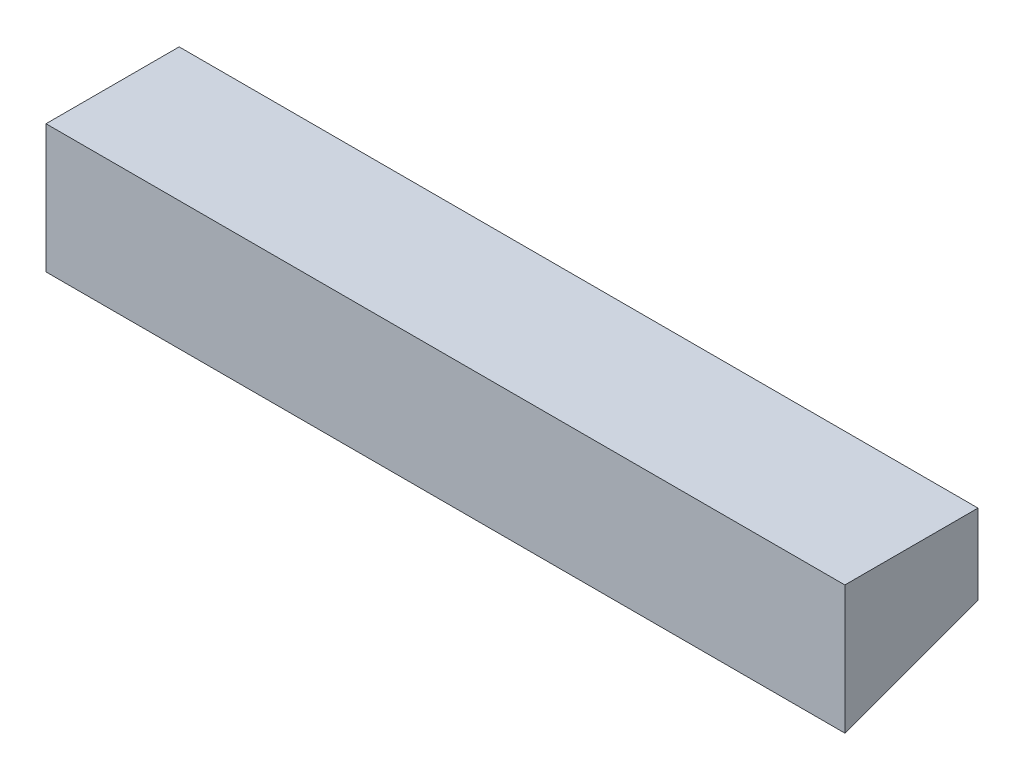
ISO-10303-21;
HEADER;
FILE_DESCRIPTION(('STEP AP214'),'2;1');
FILE_NAME('part.step','',(''),(''),'','','');
FILE_SCHEMA(('AUTOMOTIVE_DESIGN { 1 0 10303 214 1 1 1 1 }'));
ENDSEC;
DATA;
#1=APPLICATION_CONTEXT('core data for automotive mechanical design processes');
#2=APPLICATION_PROTOCOL_DEFINITION('international standard','automotive_design',2000,#1);
#3=PRODUCT_CONTEXT('',#1,'mechanical');
#4=PRODUCT('Part','Part','',(#3));
#5=PRODUCT_RELATED_PRODUCT_CATEGORY('part','',(#4));
#6=PRODUCT_DEFINITION_FORMATION('','',#4);
#7=PRODUCT_DEFINITION_CONTEXT('part definition',#1,'design');
#8=PRODUCT_DEFINITION('design','',#6,#7);
#9=PRODUCT_DEFINITION_SHAPE('','',#8);
#10=(LENGTH_UNIT() NAMED_UNIT(*) SI_UNIT(.MILLI.,.METRE.));
#11=(NAMED_UNIT(*) PLANE_ANGLE_UNIT() SI_UNIT($,.RADIAN.));
#12=(NAMED_UNIT(*) SI_UNIT($,.STERADIAN.) SOLID_ANGLE_UNIT());
#13=UNCERTAINTY_MEASURE_WITH_UNIT(LENGTH_MEASURE(1.E-05),#10,'distance_accuracy_value','');
#14=(GEOMETRIC_REPRESENTATION_CONTEXT(3) GLOBAL_UNCERTAINTY_ASSIGNED_CONTEXT((#13)) GLOBAL_UNIT_ASSIGNED_CONTEXT((#10,
#11,#12)) REPRESENTATION_CONTEXT('',''));
#15=CARTESIAN_POINT('',(0.,0.,0.));
#16=DIRECTION('',(0.,0.,1.));
#17=DIRECTION('',(1.,0.,0.));
#18=AXIS2_PLACEMENT_3D('',#15,#16,#17);
#19=CARTESIAN_POINT('',(-15.,2.5,2.5));
#20=DIRECTION('',(1.,0.,0.));
#21=DIRECTION('',(0.,0.,-1.));
#22=AXIS2_PLACEMENT_3D('',#19,#20,#21);
#23=PLANE('',#22);
#24=DIRECTION('',(0.,-1.,0.));
#25=VECTOR('',#24,1.);
#26=CARTESIAN_POINT('',(-15.,2.5,-2.5));
#27=LINE('',#26,#25);
#28=CARTESIAN_POINT('',(-15.,2.5,-2.5));
#29=VERTEX_POINT('',#28);
#30=CARTESIAN_POINT('',(-15.,-0.499999999999961,-2.5));
#31=VERTEX_POINT('',#30);
#32=EDGE_CURVE('E99',#29,#31,#27,.T.);
#33=ORIENTED_EDGE('',*,*,#32,.T.);
#34=DIRECTION('',(0.,0.342020143325666,-0.939692620785909));
#35=VECTOR('',#34,1.);
#36=CARTESIAN_POINT('',(-15.,-2.5,2.9949548389094));
#37=LINE('',#36,#35);
#38=CARTESIAN_POINT('',(-15.,-2.31985117133096,2.5));
#39=VERTEX_POINT('',#38);
#40=EDGE_CURVE('E11',#31,#39,#37,.F.);
#41=ORIENTED_EDGE('',*,*,#40,.T.);
#42=DIRECTION('',(0.,-1.,0.));
#43=VECTOR('',#42,1.);
#44=CARTESIAN_POINT('',(-15.,2.5,2.5));
#45=LINE('',#44,#43);
#46=CARTESIAN_POINT('',(-15.,2.5,2.5));
#47=VERTEX_POINT('',#46);
#48=EDGE_CURVE('E82',#47,#39,#45,.T.);
#49=ORIENTED_EDGE('',*,*,#48,.F.);
#50=DIRECTION('',(0.,0.,-1.));
#51=VECTOR('',#50,1.);
#52=CARTESIAN_POINT('',(-15.,2.5,2.5));
#53=LINE('',#52,#51);
#54=EDGE_CURVE('E90',#47,#29,#53,.T.);
#55=ORIENTED_EDGE('',*,*,#54,.T.);
#56=EDGE_LOOP('',(#33,#41,#49,#55));
#57=FACE_BOUND('',#56,.T.);
#58=ADVANCED_FACE('F35',(#57),#23,.F.);
#59=CARTESIAN_POINT('',(15.,2.5,2.5));
#60=DIRECTION('',(-1.,0.,0.));
#61=DIRECTION('',(0.,-1.,0.));
#62=AXIS2_PLACEMENT_3D('',#59,#60,#61);
#63=PLANE('',#62);
#64=DIRECTION('',(0.,1.,0.));
#65=VECTOR('',#64,1.);
#66=CARTESIAN_POINT('',(15.,2.5,2.5));
#67=LINE('',#66,#65);
#68=CARTESIAN_POINT('',(15.,-2.31985117133095,2.5));
#69=VERTEX_POINT('',#68);
#70=CARTESIAN_POINT('',(15.,2.5,2.5));
#71=VERTEX_POINT('',#70);
#72=EDGE_CURVE('E74',#69,#71,#67,.T.);
#73=ORIENTED_EDGE('',*,*,#72,.F.);
#74=DIRECTION('',(0.,-0.342020143325666,0.939692620785909));
#75=VECTOR('',#74,1.);
#76=CARTESIAN_POINT('',(15.,-2.49999999999999,2.9949548389094));
#77=LINE('',#76,#75);
#78=CARTESIAN_POINT('',(15.,-0.499999999999958,-2.5));
#79=VERTEX_POINT('',#78);
#80=EDGE_CURVE('E56',#69,#79,#77,.F.);
#81=ORIENTED_EDGE('',*,*,#80,.T.);
#82=DIRECTION('',(0.,1.,0.));
#83=VECTOR('',#82,1.);
#84=CARTESIAN_POINT('',(15.,2.5,-2.5));
#85=LINE('',#84,#83);
#86=CARTESIAN_POINT('',(15.,2.5,-2.5));
#87=VERTEX_POINT('',#86);
#88=EDGE_CURVE('E87',#79,#87,#85,.T.);
#89=ORIENTED_EDGE('',*,*,#88,.T.);
#90=DIRECTION('',(0.,0.,-1.));
#91=VECTOR('',#90,1.);
#92=CARTESIAN_POINT('',(15.,2.5,2.5));
#93=LINE('',#92,#91);
#94=EDGE_CURVE('E85',#71,#87,#93,.T.);
#95=ORIENTED_EDGE('',*,*,#94,.F.);
#96=EDGE_LOOP('',(#73,#81,#89,#95));
#97=FACE_BOUND('',#96,.T.);
#98=ADVANCED_FACE('F86',(#97),#63,.F.);
#99=CARTESIAN_POINT('',(-15.,2.5,2.5));
#100=DIRECTION('',(0.,-1.,0.));
#101=DIRECTION('',(1.,0.,0.));
#102=AXIS2_PLACEMENT_3D('',#99,#100,#101);
#103=PLANE('',#102);
#104=DIRECTION('',(-1.,0.,0.));
#105=VECTOR('',#104,1.);
#106=CARTESIAN_POINT('',(-15.,2.5,-2.5));
#107=LINE('',#106,#105);
#108=EDGE_CURVE('E103',#87,#29,#107,.T.);
#109=ORIENTED_EDGE('',*,*,#108,.T.);
#110=ORIENTED_EDGE('',*,*,#54,.F.);
#111=DIRECTION('',(-1.,0.,0.));
#112=VECTOR('',#111,1.);
#113=CARTESIAN_POINT('',(-15.,2.5,2.5));
#114=LINE('',#113,#112);
#115=EDGE_CURVE('E79',#71,#47,#114,.T.);
#116=ORIENTED_EDGE('',*,*,#115,.F.);
#117=ORIENTED_EDGE('',*,*,#94,.T.);
#118=EDGE_LOOP('',(#109,#110,#116,#117));
#119=FACE_BOUND('',#118,.T.);
#120=ADVANCED_FACE('F92',(#119),#103,.F.);
#121=CARTESIAN_POINT('',(0.,0.,2.5));
#122=DIRECTION('',(0.,0.,1.));
#123=DIRECTION('',(1.,0.,0.));
#124=AXIS2_PLACEMENT_3D('',#121,#122,#123);
#125=PLANE('',#124);
#126=ORIENTED_EDGE('',*,*,#48,.T.);
#127=DIRECTION('',(-1.,0.,0.));
#128=VECTOR('',#127,1.);
#129=CARTESIAN_POINT('',(0.,-2.31985117133095,2.5));
#130=LINE('',#129,#128);
#131=EDGE_CURVE('E81',#39,#69,#130,.F.);
#132=ORIENTED_EDGE('',*,*,#131,.T.);
#133=ORIENTED_EDGE('',*,*,#72,.T.);
#134=ORIENTED_EDGE('',*,*,#115,.T.);
#135=EDGE_LOOP('',(#126,#132,#133,#134));
#136=FACE_BOUND('',#135,.T.);
#137=ADVANCED_FACE('F77',(#136),#125,.T.);
#138=CARTESIAN_POINT('',(0.,0.,-2.5));
#139=DIRECTION('',(0.,0.,1.));
#140=DIRECTION('',(1.,0.,0.));
#141=AXIS2_PLACEMENT_3D('',#138,#139,#140);
#142=PLANE('',#141);
#143=ORIENTED_EDGE('',*,*,#88,.F.);
#144=DIRECTION('',(-1.,0.,0.));
#145=VECTOR('',#144,1.);
#146=CARTESIAN_POINT('',(0.,-0.49999999999996,-2.5));
#147=LINE('',#146,#145);
#148=EDGE_CURVE('E43',#79,#31,#147,.T.);
#149=ORIENTED_EDGE('',*,*,#148,.T.);
#150=ORIENTED_EDGE('',*,*,#32,.F.);
#151=ORIENTED_EDGE('',*,*,#108,.F.);
#152=EDGE_LOOP('',(#143,#149,#150,#151));
#153=FACE_BOUND('',#152,.T.);
#154=ADVANCED_FACE('F108',(#153),#142,.F.);
#155=CARTESIAN_POINT('',(-15.,-2.5,2.9949548389094));
#156=DIRECTION('',(0.,0.939692620785909,0.342020143325666));
#157=DIRECTION('',(1.,0.,0.));
#158=AXIS2_PLACEMENT_3D('',#155,#156,#157);
#159=PLANE('',#158);
#160=ORIENTED_EDGE('',*,*,#40,.F.);
#161=ORIENTED_EDGE('',*,*,#148,.F.);
#162=ORIENTED_EDGE('',*,*,#80,.F.);
#163=ORIENTED_EDGE('',*,*,#131,.F.);
#164=EDGE_LOOP('',(#160,#161,#162,#163));
#165=FACE_BOUND('',#164,.T.);
#166=ADVANCED_FACE('F37',(#165),#159,.F.);
#167=CLOSED_SHELL('',(#58,#98,#120,#137,#154,#166));
#168=MANIFOLD_SOLID_BREP('B2',#167);
#169=ADVANCED_BREP_SHAPE_REPRESENTATION('',(#18,#168),#14);
#170=SHAPE_DEFINITION_REPRESENTATION(#9,#169);
ENDSEC;
END-ISO-10303-21;
